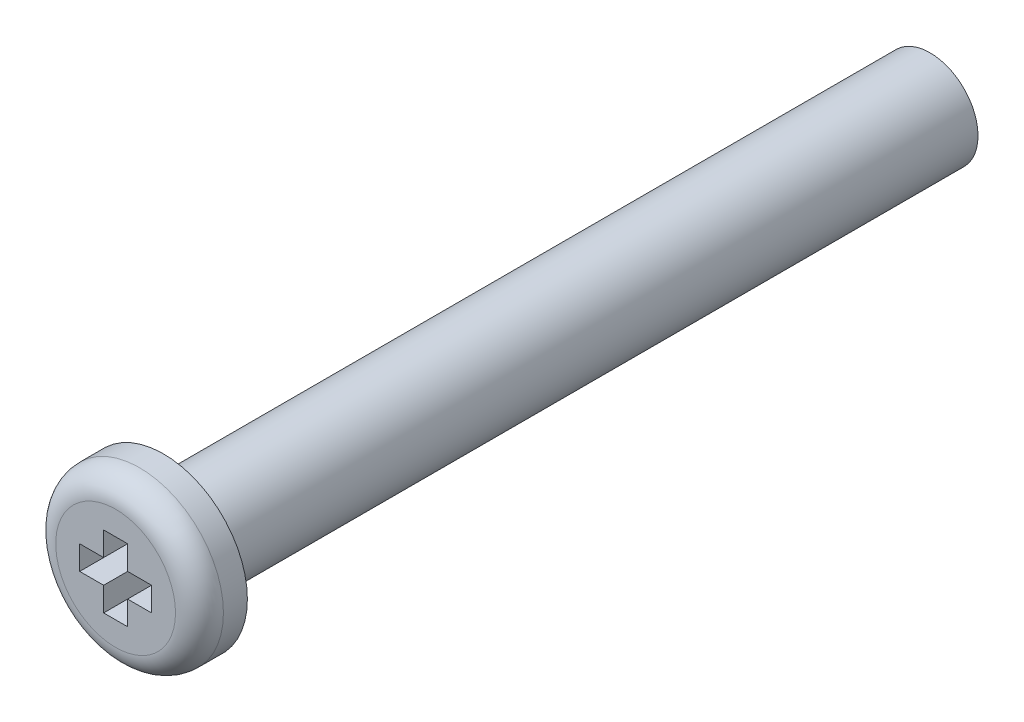
ISO-10303-21;
HEADER;
FILE_DESCRIPTION(('STEP AP214'),'2;1');
FILE_NAME('part.step','',(''),(''),'','','');
FILE_SCHEMA(('AUTOMOTIVE_DESIGN { 1 0 10303 214 1 1 1 1 }'));
ENDSEC;
DATA;
#1=APPLICATION_CONTEXT('core data for automotive mechanical design processes');
#2=APPLICATION_PROTOCOL_DEFINITION('international standard','automotive_design',2000,#1);
#3=PRODUCT_CONTEXT('',#1,'mechanical');
#4=PRODUCT('Part','Part','',(#3));
#5=PRODUCT_RELATED_PRODUCT_CATEGORY('part','',(#4));
#6=PRODUCT_DEFINITION_FORMATION('','',#4);
#7=PRODUCT_DEFINITION_CONTEXT('part definition',#1,'design');
#8=PRODUCT_DEFINITION('design','',#6,#7);
#9=PRODUCT_DEFINITION_SHAPE('','',#8);
#10=(LENGTH_UNIT() NAMED_UNIT(*) SI_UNIT(.MILLI.,.METRE.));
#11=(NAMED_UNIT(*) PLANE_ANGLE_UNIT() SI_UNIT($,.RADIAN.));
#12=(NAMED_UNIT(*) SI_UNIT($,.STERADIAN.) SOLID_ANGLE_UNIT());
#13=UNCERTAINTY_MEASURE_WITH_UNIT(LENGTH_MEASURE(1.E-05),#10,'distance_accuracy_value','');
#14=(GEOMETRIC_REPRESENTATION_CONTEXT(3) GLOBAL_UNCERTAINTY_ASSIGNED_CONTEXT((#13)) GLOBAL_UNIT_ASSIGNED_CONTEXT((#10,
#11,#12)) REPRESENTATION_CONTEXT('',''));
#15=CARTESIAN_POINT('',(0.,0.,0.));
#16=DIRECTION('',(0.,0.,1.));
#17=DIRECTION('',(1.,0.,0.));
#18=AXIS2_PLACEMENT_3D('',#15,#16,#17);
#19=CARTESIAN_POINT('',(0.,0.,32.));
#20=DIRECTION('',(0.,0.,-1.));
#21=DIRECTION('',(-1.,0.,0.));
#22=AXIS2_PLACEMENT_3D('',#19,#20,#21);
#23=CYLINDRICAL_SURFACE('',#22,2.);
#24=CARTESIAN_POINT('',(0.,0.,32.));
#25=DIRECTION('',(0.,0.,1.));
#26=DIRECTION('',(1.,0.,0.));
#27=AXIS2_PLACEMENT_3D('',#24,#25,#26);
#28=CIRCLE('',#27,2.);
#29=CARTESIAN_POINT('',(2.,0.,32.));
#30=VERTEX_POINT('',#29);
#31=EDGE_CURVE('E210',#30,#30,#28,.T.);
#32=ORIENTED_EDGE('',*,*,#31,.F.);
#33=EDGE_LOOP('',(#32));
#34=FACE_BOUND('',#33,.T.);
#35=CARTESIAN_POINT('',(0.,0.,0.));
#36=DIRECTION('',(0.,0.,1.));
#37=DIRECTION('',(1.,0.,0.));
#38=AXIS2_PLACEMENT_3D('',#35,#36,#37);
#39=CIRCLE('',#38,2.);
#40=CARTESIAN_POINT('',(2.,0.,0.));
#41=VERTEX_POINT('',#40);
#42=EDGE_CURVE('E209',#41,#41,#39,.T.);
#43=ORIENTED_EDGE('',*,*,#42,.T.);
#44=EDGE_LOOP('',(#43));
#45=FACE_BOUND('',#44,.T.);
#46=ADVANCED_FACE('F34',(#34,#45),#23,.T.);
#47=CARTESIAN_POINT('',(0.,0.,0.));
#48=DIRECTION('',(0.,0.,1.));
#49=DIRECTION('',(1.,0.,0.));
#50=AXIS2_PLACEMENT_3D('',#47,#48,#49);
#51=PLANE('',#50);
#52=ORIENTED_EDGE('',*,*,#42,.F.);
#53=EDGE_LOOP('',(#52));
#54=FACE_BOUND('',#53,.T.);
#55=ADVANCED_FACE('F233',(#54),#51,.F.);
#56=CARTESIAN_POINT('',(0.,0.,34.));
#57=DIRECTION('',(0.,0.,-1.));
#58=DIRECTION('',(-1.,0.,0.));
#59=AXIS2_PLACEMENT_3D('',#56,#57,#58);
#60=CYLINDRICAL_SURFACE('',#59,3.5);
#61=CARTESIAN_POINT('',(0.,0.,33.));
#62=DIRECTION('',(0.,0.,1.));
#63=DIRECTION('',(1.,0.,0.));
#64=AXIS2_PLACEMENT_3D('',#61,#62,#63);
#65=CIRCLE('',#64,3.5);
#66=CARTESIAN_POINT('',(3.5,0.,33.));
#67=VERTEX_POINT('',#66);
#68=EDGE_CURVE('E11',#67,#67,#65,.F.);
#69=ORIENTED_EDGE('',*,*,#68,.T.);
#70=EDGE_LOOP('',(#69));
#71=FACE_BOUND('',#70,.T.);
#72=CARTESIAN_POINT('',(0.,0.,32.));
#73=DIRECTION('',(0.,0.,1.));
#74=DIRECTION('',(1.,0.,0.));
#75=AXIS2_PLACEMENT_3D('',#72,#73,#74);
#76=CIRCLE('',#75,3.5);
#77=CARTESIAN_POINT('',(3.5,0.,32.));
#78=VERTEX_POINT('',#77);
#79=EDGE_CURVE('E189',#78,#78,#76,.T.);
#80=ORIENTED_EDGE('',*,*,#79,.T.);
#81=EDGE_LOOP('',(#80));
#82=FACE_BOUND('',#81,.T.);
#83=ADVANCED_FACE('F238',(#71,#82),#60,.T.);
#84=CARTESIAN_POINT('',(0.,0.,34.));
#85=DIRECTION('',(0.,0.,1.));
#86=DIRECTION('',(1.,0.,0.));
#87=AXIS2_PLACEMENT_3D('',#84,#85,#86);
#88=PLANE('',#87);
#89=DIRECTION('',(-1.,0.,0.));
#90=VECTOR('',#89,1.);
#91=CARTESIAN_POINT('',(0.,1.5,34.));
#92=LINE('',#91,#90);
#93=CARTESIAN_POINT('',(0.5,1.5,34.));
#94=VERTEX_POINT('',#93);
#95=CARTESIAN_POINT('',(-0.5,1.5,34.));
#96=VERTEX_POINT('',#95);
#97=EDGE_CURVE('E186',#94,#96,#92,.T.);
#98=ORIENTED_EDGE('',*,*,#97,.F.);
#99=DIRECTION('',(0.,1.,0.));
#100=VECTOR('',#99,1.);
#101=CARTESIAN_POINT('',(0.5,1.5,34.));
#102=LINE('',#101,#100);
#103=CARTESIAN_POINT('',(0.5,0.5,34.));
#104=VERTEX_POINT('',#103);
#105=EDGE_CURVE('E184',#104,#94,#102,.T.);
#106=ORIENTED_EDGE('',*,*,#105,.F.);
#107=DIRECTION('',(-1.,0.,0.));
#108=VECTOR('',#107,1.);
#109=CARTESIAN_POINT('',(0.5,0.5,34.));
#110=LINE('',#109,#108);
#111=CARTESIAN_POINT('',(1.5,0.5,34.));
#112=VERTEX_POINT('',#111);
#113=EDGE_CURVE('E182',#112,#104,#110,.T.);
#114=ORIENTED_EDGE('',*,*,#113,.F.);
#115=DIRECTION('',(0.,1.,0.));
#116=VECTOR('',#115,1.);
#117=CARTESIAN_POINT('',(1.5,0.5,34.));
#118=LINE('',#117,#116);
#119=CARTESIAN_POINT('',(1.5,-0.5,34.));
#120=VERTEX_POINT('',#119);
#121=EDGE_CURVE('E133',#120,#112,#118,.T.);
#122=ORIENTED_EDGE('',*,*,#121,.F.);
#123=DIRECTION('',(1.,0.,0.));
#124=VECTOR('',#123,1.);
#125=CARTESIAN_POINT('',(1.5,-0.5,34.));
#126=LINE('',#125,#124);
#127=CARTESIAN_POINT('',(0.5,-0.5,34.));
#128=VERTEX_POINT('',#127);
#129=EDGE_CURVE('E178',#128,#120,#126,.T.);
#130=ORIENTED_EDGE('',*,*,#129,.F.);
#131=DIRECTION('',(0.,1.,0.));
#132=VECTOR('',#131,1.);
#133=CARTESIAN_POINT('',(0.5,-0.5,34.));
#134=LINE('',#133,#132);
#135=CARTESIAN_POINT('',(0.5,-1.5,34.));
#136=VERTEX_POINT('',#135);
#137=EDGE_CURVE('E175',#136,#128,#134,.T.);
#138=ORIENTED_EDGE('',*,*,#137,.F.);
#139=DIRECTION('',(1.,0.,0.));
#140=VECTOR('',#139,1.);
#141=CARTESIAN_POINT('',(0.5,-1.5,34.));
#142=LINE('',#141,#140);
#143=CARTESIAN_POINT('',(-0.5,-1.5,34.));
#144=VERTEX_POINT('',#143);
#145=EDGE_CURVE('E172',#144,#136,#142,.T.);
#146=ORIENTED_EDGE('',*,*,#145,.F.);
#147=DIRECTION('',(0.,-1.,0.));
#148=VECTOR('',#147,1.);
#149=CARTESIAN_POINT('',(-0.5,-1.5,34.));
#150=LINE('',#149,#148);
#151=CARTESIAN_POINT('',(-0.5,-0.5,34.));
#152=VERTEX_POINT('',#151);
#153=EDGE_CURVE('E169',#152,#144,#150,.T.);
#154=ORIENTED_EDGE('',*,*,#153,.F.);
#155=DIRECTION('',(1.,0.,0.));
#156=VECTOR('',#155,1.);
#157=CARTESIAN_POINT('',(-0.5,-0.5,34.));
#158=LINE('',#157,#156);
#159=CARTESIAN_POINT('',(-1.5,-0.5,34.));
#160=VERTEX_POINT('',#159);
#161=EDGE_CURVE('E166',#160,#152,#158,.T.);
#162=ORIENTED_EDGE('',*,*,#161,.F.);
#163=DIRECTION('',(0.,-1.,0.));
#164=VECTOR('',#163,1.);
#165=CARTESIAN_POINT('',(-1.5,-0.5,34.));
#166=LINE('',#165,#164);
#167=CARTESIAN_POINT('',(-1.5,0.5,34.));
#168=VERTEX_POINT('',#167);
#169=EDGE_CURVE('E163',#168,#160,#166,.T.);
#170=ORIENTED_EDGE('',*,*,#169,.F.);
#171=DIRECTION('',(-1.,0.,0.));
#172=VECTOR('',#171,1.);
#173=CARTESIAN_POINT('',(-1.5,0.5,34.));
#174=LINE('',#173,#172);
#175=CARTESIAN_POINT('',(-0.5,0.5,34.));
#176=VERTEX_POINT('',#175);
#177=EDGE_CURVE('E160',#176,#168,#174,.T.);
#178=ORIENTED_EDGE('',*,*,#177,.F.);
#179=DIRECTION('',(0.,-1.,0.));
#180=VECTOR('',#179,1.);
#181=CARTESIAN_POINT('',(-0.5,0.5,34.));
#182=LINE('',#181,#180);
#183=EDGE_CURVE('E158',#96,#176,#182,.T.);
#184=ORIENTED_EDGE('',*,*,#183,.F.);
#185=EDGE_LOOP('',(#98,#106,#114,#122,#130,#138,#146,#154,#162,#170,#178,#184));
#186=FACE_BOUND('',#185,.T.);
#187=CARTESIAN_POINT('',(0.,0.,34.));
#188=DIRECTION('',(0.,0.,1.));
#189=DIRECTION('',(1.,0.,0.));
#190=AXIS2_PLACEMENT_3D('',#187,#188,#189);
#191=CIRCLE('',#190,2.5);
#192=CARTESIAN_POINT('',(2.5,0.,34.));
#193=VERTEX_POINT('',#192);
#194=EDGE_CURVE('E42',#193,#193,#191,.T.);
#195=ORIENTED_EDGE('',*,*,#194,.T.);
#196=EDGE_LOOP('',(#195));
#197=FACE_BOUND('',#196,.T.);
#198=ADVANCED_FACE('F217',(#186,#197),#88,.T.);
#199=CARTESIAN_POINT('',(0.,0.,32.));
#200=DIRECTION('',(0.,0.,1.));
#201=DIRECTION('',(1.,0.,0.));
#202=AXIS2_PLACEMENT_3D('',#199,#200,#201);
#203=PLANE('',#202);
#204=ORIENTED_EDGE('',*,*,#31,.T.);
#205=EDGE_LOOP('',(#204));
#206=FACE_BOUND('',#205,.T.);
#207=ORIENTED_EDGE('',*,*,#79,.F.);
#208=EDGE_LOOP('',(#207));
#209=FACE_BOUND('',#208,.T.);
#210=ADVANCED_FACE('F221',(#206,#209),#203,.F.);
#211=CARTESIAN_POINT('',(0.,0.,33.));
#212=DIRECTION('',(0.,0.,1.));
#213=DIRECTION('',(1.,0.,0.));
#214=AXIS2_PLACEMENT_3D('',#211,#212,#213);
#215=TOROIDAL_SURFACE('',#214,2.5,1.);
#216=ORIENTED_EDGE('',*,*,#68,.F.);
#217=EDGE_LOOP('',(#216));
#218=FACE_BOUND('',#217,.T.);
#219=ORIENTED_EDGE('',*,*,#194,.F.);
#220=EDGE_LOOP('',(#219));
#221=FACE_BOUND('',#220,.T.);
#222=ADVANCED_FACE('F36',(#218,#221),#215,.T.);
#223=CARTESIAN_POINT('',(0.,1.5,32.));
#224=DIRECTION('',(0.,1.,0.));
#225=DIRECTION('',(0.,0.,1.));
#226=AXIS2_PLACEMENT_3D('',#223,#224,#225);
#227=PLANE('',#226);
#228=ORIENTED_EDGE('',*,*,#97,.T.);
#229=DIRECTION('',(0.,0.,1.));
#230=VECTOR('',#229,1.);
#231=CARTESIAN_POINT('',(-0.5,1.5,32.));
#232=LINE('',#231,#230);
#233=CARTESIAN_POINT('',(-0.5,1.5,32.));
#234=VERTEX_POINT('',#233);
#235=EDGE_CURVE('E49',#234,#96,#232,.T.);
#236=ORIENTED_EDGE('',*,*,#235,.F.);
#237=DIRECTION('',(-1.,0.,0.));
#238=VECTOR('',#237,1.);
#239=CARTESIAN_POINT('',(0.,1.5,32.));
#240=LINE('',#239,#238);
#241=CARTESIAN_POINT('',(0.5,1.5,32.));
#242=VERTEX_POINT('',#241);
#243=EDGE_CURVE('E57',#242,#234,#240,.T.);
#244=ORIENTED_EDGE('',*,*,#243,.F.);
#245=DIRECTION('',(0.,0.,1.));
#246=VECTOR('',#245,1.);
#247=CARTESIAN_POINT('',(0.5,1.5,32.));
#248=LINE('',#247,#246);
#249=EDGE_CURVE('E95',#242,#94,#248,.T.);
#250=ORIENTED_EDGE('',*,*,#249,.T.);
#251=EDGE_LOOP('',(#228,#236,#244,#250));
#252=FACE_BOUND('',#251,.T.);
#253=ADVANCED_FACE('F220',(#252),#227,.F.);
#254=CARTESIAN_POINT('',(0.5,1.5,32.));
#255=DIRECTION('',(1.,0.,0.));
#256=DIRECTION('',(0.,1.,0.));
#257=AXIS2_PLACEMENT_3D('',#254,#255,#256);
#258=PLANE('',#257);
#259=ORIENTED_EDGE('',*,*,#105,.T.);
#260=ORIENTED_EDGE('',*,*,#249,.F.);
#261=DIRECTION('',(0.,1.,0.));
#262=VECTOR('',#261,1.);
#263=CARTESIAN_POINT('',(0.5,1.5,32.));
#264=LINE('',#263,#262);
#265=CARTESIAN_POINT('',(0.5,0.5,32.));
#266=VERTEX_POINT('',#265);
#267=EDGE_CURVE('E146',#266,#242,#264,.T.);
#268=ORIENTED_EDGE('',*,*,#267,.F.);
#269=DIRECTION('',(0.,0.,1.));
#270=VECTOR('',#269,1.);
#271=CARTESIAN_POINT('',(0.5,0.5,32.));
#272=LINE('',#271,#270);
#273=EDGE_CURVE('E137',#266,#104,#272,.T.);
#274=ORIENTED_EDGE('',*,*,#273,.T.);
#275=EDGE_LOOP('',(#259,#260,#268,#274));
#276=FACE_BOUND('',#275,.T.);
#277=ADVANCED_FACE('F227',(#276),#258,.F.);
#278=CARTESIAN_POINT('',(0.5,0.5,32.));
#279=DIRECTION('',(0.,1.,0.));
#280=DIRECTION('',(0.,0.,1.));
#281=AXIS2_PLACEMENT_3D('',#278,#279,#280);
#282=PLANE('',#281);
#283=ORIENTED_EDGE('',*,*,#113,.T.);
#284=ORIENTED_EDGE('',*,*,#273,.F.);
#285=DIRECTION('',(-1.,0.,0.));
#286=VECTOR('',#285,1.);
#287=CARTESIAN_POINT('',(0.5,0.5,32.));
#288=LINE('',#287,#286);
#289=CARTESIAN_POINT('',(1.5,0.5,32.));
#290=VERTEX_POINT('',#289);
#291=EDGE_CURVE('E141',#290,#266,#288,.T.);
#292=ORIENTED_EDGE('',*,*,#291,.F.);
#293=DIRECTION('',(0.,0.,1.));
#294=VECTOR('',#293,1.);
#295=CARTESIAN_POINT('',(1.5,0.5,32.));
#296=LINE('',#295,#294);
#297=EDGE_CURVE('E126',#290,#112,#296,.T.);
#298=ORIENTED_EDGE('',*,*,#297,.T.);
#299=EDGE_LOOP('',(#283,#284,#292,#298));
#300=FACE_BOUND('',#299,.T.);
#301=ADVANCED_FACE('F142',(#300),#282,.F.);
#302=CARTESIAN_POINT('',(1.5,0.5,32.));
#303=DIRECTION('',(1.,0.,0.));
#304=DIRECTION('',(0.,1.,0.));
#305=AXIS2_PLACEMENT_3D('',#302,#303,#304);
#306=PLANE('',#305);
#307=ORIENTED_EDGE('',*,*,#121,.T.);
#308=ORIENTED_EDGE('',*,*,#297,.F.);
#309=DIRECTION('',(0.,1.,0.));
#310=VECTOR('',#309,1.);
#311=CARTESIAN_POINT('',(1.5,0.5,32.));
#312=LINE('',#311,#310);
#313=CARTESIAN_POINT('',(1.5,-0.5,32.));
#314=VERTEX_POINT('',#313);
#315=EDGE_CURVE('E130',#314,#290,#312,.T.);
#316=ORIENTED_EDGE('',*,*,#315,.F.);
#317=DIRECTION('',(0.,0.,1.));
#318=VECTOR('',#317,1.);
#319=CARTESIAN_POINT('',(1.5,-0.5,32.));
#320=LINE('',#319,#318);
#321=EDGE_CURVE('E138',#314,#120,#320,.T.);
#322=ORIENTED_EDGE('',*,*,#321,.T.);
#323=EDGE_LOOP('',(#307,#308,#316,#322));
#324=FACE_BOUND('',#323,.T.);
#325=ADVANCED_FACE('F128',(#324),#306,.F.);
#326=CARTESIAN_POINT('',(1.5,-0.5,32.));
#327=DIRECTION('',(0.,-1.,0.));
#328=DIRECTION('',(0.,0.,-1.));
#329=AXIS2_PLACEMENT_3D('',#326,#327,#328);
#330=PLANE('',#329);
#331=ORIENTED_EDGE('',*,*,#129,.T.);
#332=ORIENTED_EDGE('',*,*,#321,.F.);
#333=DIRECTION('',(1.,0.,0.));
#334=VECTOR('',#333,1.);
#335=CARTESIAN_POINT('',(1.5,-0.5,32.));
#336=LINE('',#335,#334);
#337=CARTESIAN_POINT('',(0.5,-0.5,32.));
#338=VERTEX_POINT('',#337);
#339=EDGE_CURVE('E151',#338,#314,#336,.T.);
#340=ORIENTED_EDGE('',*,*,#339,.F.);
#341=DIRECTION('',(0.,0.,1.));
#342=VECTOR('',#341,1.);
#343=CARTESIAN_POINT('',(0.5,-0.5,32.));
#344=LINE('',#343,#342);
#345=EDGE_CURVE('E192',#338,#128,#344,.T.);
#346=ORIENTED_EDGE('',*,*,#345,.T.);
#347=EDGE_LOOP('',(#331,#332,#340,#346));
#348=FACE_BOUND('',#347,.T.);
#349=ADVANCED_FACE('F276',(#348),#330,.F.);
#350=CARTESIAN_POINT('',(0.5,-0.5,32.));
#351=DIRECTION('',(1.,0.,0.));
#352=DIRECTION('',(0.,1.,0.));
#353=AXIS2_PLACEMENT_3D('',#350,#351,#352);
#354=PLANE('',#353);
#355=ORIENTED_EDGE('',*,*,#137,.T.);
#356=ORIENTED_EDGE('',*,*,#345,.F.);
#357=DIRECTION('',(0.,1.,0.));
#358=VECTOR('',#357,1.);
#359=CARTESIAN_POINT('',(0.5,-0.5,32.));
#360=LINE('',#359,#358);
#361=CARTESIAN_POINT('',(0.5,-1.5,32.));
#362=VERTEX_POINT('',#361);
#363=EDGE_CURVE('E153',#362,#338,#360,.T.);
#364=ORIENTED_EDGE('',*,*,#363,.F.);
#365=DIRECTION('',(0.,0.,1.));
#366=VECTOR('',#365,1.);
#367=CARTESIAN_POINT('',(0.5,-1.5,32.));
#368=LINE('',#367,#366);
#369=EDGE_CURVE('E194',#362,#136,#368,.T.);
#370=ORIENTED_EDGE('',*,*,#369,.T.);
#371=EDGE_LOOP('',(#355,#356,#364,#370));
#372=FACE_BOUND('',#371,.T.);
#373=ADVANCED_FACE('F272',(#372),#354,.F.);
#374=CARTESIAN_POINT('',(0.5,-1.5,32.));
#375=DIRECTION('',(0.,-1.,0.));
#376=DIRECTION('',(0.,0.,-1.));
#377=AXIS2_PLACEMENT_3D('',#374,#375,#376);
#378=PLANE('',#377);
#379=ORIENTED_EDGE('',*,*,#145,.T.);
#380=ORIENTED_EDGE('',*,*,#369,.F.);
#381=DIRECTION('',(1.,0.,0.));
#382=VECTOR('',#381,1.);
#383=CARTESIAN_POINT('',(0.5,-1.5,32.));
#384=LINE('',#383,#382);
#385=CARTESIAN_POINT('',(-0.5,-1.5,32.));
#386=VERTEX_POINT('',#385);
#387=EDGE_CURVE('E426',#386,#362,#384,.T.);
#388=ORIENTED_EDGE('',*,*,#387,.F.);
#389=DIRECTION('',(0.,0.,1.));
#390=VECTOR('',#389,1.);
#391=CARTESIAN_POINT('',(-0.5,-1.5,32.));
#392=LINE('',#391,#390);
#393=EDGE_CURVE('E196',#386,#144,#392,.T.);
#394=ORIENTED_EDGE('',*,*,#393,.T.);
#395=EDGE_LOOP('',(#379,#380,#388,#394));
#396=FACE_BOUND('',#395,.T.);
#397=ADVANCED_FACE('F268',(#396),#378,.F.);
#398=CARTESIAN_POINT('',(-0.5,-1.5,32.));
#399=DIRECTION('',(-1.,0.,0.));
#400=DIRECTION('',(0.,0.,1.));
#401=AXIS2_PLACEMENT_3D('',#398,#399,#400);
#402=PLANE('',#401);
#403=ORIENTED_EDGE('',*,*,#153,.T.);
#404=ORIENTED_EDGE('',*,*,#393,.F.);
#405=DIRECTION('',(0.,-1.,0.));
#406=VECTOR('',#405,1.);
#407=CARTESIAN_POINT('',(-0.5,-1.5,32.));
#408=LINE('',#407,#406);
#409=CARTESIAN_POINT('',(-0.5,-0.5,32.));
#410=VERTEX_POINT('',#409);
#411=EDGE_CURVE('E423',#410,#386,#408,.T.);
#412=ORIENTED_EDGE('',*,*,#411,.F.);
#413=DIRECTION('',(0.,0.,1.));
#414=VECTOR('',#413,1.);
#415=CARTESIAN_POINT('',(-0.5,-0.5,32.));
#416=LINE('',#415,#414);
#417=EDGE_CURVE('E198',#410,#152,#416,.T.);
#418=ORIENTED_EDGE('',*,*,#417,.T.);
#419=EDGE_LOOP('',(#403,#404,#412,#418));
#420=FACE_BOUND('',#419,.T.);
#421=ADVANCED_FACE('F264',(#420),#402,.F.);
#422=CARTESIAN_POINT('',(-0.5,-0.5,32.));
#423=DIRECTION('',(0.,-1.,0.));
#424=DIRECTION('',(1.,0.,0.));
#425=AXIS2_PLACEMENT_3D('',#422,#423,#424);
#426=PLANE('',#425);
#427=ORIENTED_EDGE('',*,*,#161,.T.);
#428=ORIENTED_EDGE('',*,*,#417,.F.);
#429=DIRECTION('',(1.,0.,0.));
#430=VECTOR('',#429,1.);
#431=CARTESIAN_POINT('',(-0.5,-0.5,32.));
#432=LINE('',#431,#430);
#433=CARTESIAN_POINT('',(-1.5,-0.5,32.));
#434=VERTEX_POINT('',#433);
#435=EDGE_CURVE('E420',#434,#410,#432,.T.);
#436=ORIENTED_EDGE('',*,*,#435,.F.);
#437=DIRECTION('',(0.,0.,1.));
#438=VECTOR('',#437,1.);
#439=CARTESIAN_POINT('',(-1.5,-0.5,32.));
#440=LINE('',#439,#438);
#441=EDGE_CURVE('E200',#434,#160,#440,.T.);
#442=ORIENTED_EDGE('',*,*,#441,.T.);
#443=EDGE_LOOP('',(#427,#428,#436,#442));
#444=FACE_BOUND('',#443,.T.);
#445=ADVANCED_FACE('F260',(#444),#426,.F.);
#446=CARTESIAN_POINT('',(-1.5,-0.5,32.));
#447=DIRECTION('',(-1.,0.,0.));
#448=DIRECTION('',(0.,0.,1.));
#449=AXIS2_PLACEMENT_3D('',#446,#447,#448);
#450=PLANE('',#449);
#451=ORIENTED_EDGE('',*,*,#169,.T.);
#452=ORIENTED_EDGE('',*,*,#441,.F.);
#453=DIRECTION('',(0.,-1.,0.));
#454=VECTOR('',#453,1.);
#455=CARTESIAN_POINT('',(-1.5,-0.5,32.));
#456=LINE('',#455,#454);
#457=CARTESIAN_POINT('',(-1.5,0.5,32.));
#458=VERTEX_POINT('',#457);
#459=EDGE_CURVE('E414',#458,#434,#456,.T.);
#460=ORIENTED_EDGE('',*,*,#459,.F.);
#461=DIRECTION('',(0.,0.,1.));
#462=VECTOR('',#461,1.);
#463=CARTESIAN_POINT('',(-1.5,0.5,32.));
#464=LINE('',#463,#462);
#465=EDGE_CURVE('E202',#458,#168,#464,.T.);
#466=ORIENTED_EDGE('',*,*,#465,.T.);
#467=EDGE_LOOP('',(#451,#452,#460,#466));
#468=FACE_BOUND('',#467,.T.);
#469=ADVANCED_FACE('F256',(#468),#450,.F.);
#470=CARTESIAN_POINT('',(-1.5,0.5,32.));
#471=DIRECTION('',(0.,1.,0.));
#472=DIRECTION('',(0.,0.,1.));
#473=AXIS2_PLACEMENT_3D('',#470,#471,#472);
#474=PLANE('',#473);
#475=ORIENTED_EDGE('',*,*,#177,.T.);
#476=ORIENTED_EDGE('',*,*,#465,.F.);
#477=DIRECTION('',(-1.,0.,0.));
#478=VECTOR('',#477,1.);
#479=CARTESIAN_POINT('',(-1.5,0.5,32.));
#480=LINE('',#479,#478);
#481=CARTESIAN_POINT('',(-0.5,0.5,32.));
#482=VERTEX_POINT('',#481);
#483=EDGE_CURVE('E411',#482,#458,#480,.T.);
#484=ORIENTED_EDGE('',*,*,#483,.F.);
#485=DIRECTION('',(0.,0.,1.));
#486=VECTOR('',#485,1.);
#487=CARTESIAN_POINT('',(-0.5,0.5,32.));
#488=LINE('',#487,#486);
#489=EDGE_CURVE('E204',#482,#176,#488,.T.);
#490=ORIENTED_EDGE('',*,*,#489,.T.);
#491=EDGE_LOOP('',(#475,#476,#484,#490));
#492=FACE_BOUND('',#491,.T.);
#493=ADVANCED_FACE('F253',(#492),#474,.F.);
#494=CARTESIAN_POINT('',(-0.5,0.5,32.));
#495=DIRECTION('',(-1.,0.,0.));
#496=DIRECTION('',(0.,0.,1.));
#497=AXIS2_PLACEMENT_3D('',#494,#495,#496);
#498=PLANE('',#497);
#499=ORIENTED_EDGE('',*,*,#183,.T.);
#500=ORIENTED_EDGE('',*,*,#489,.F.);
#501=DIRECTION('',(0.,-1.,0.));
#502=VECTOR('',#501,1.);
#503=CARTESIAN_POINT('',(-0.5,0.5,32.));
#504=LINE('',#503,#502);
#505=EDGE_CURVE('E409',#234,#482,#504,.T.);
#506=ORIENTED_EDGE('',*,*,#505,.F.);
#507=ORIENTED_EDGE('',*,*,#235,.T.);
#508=EDGE_LOOP('',(#499,#500,#506,#507));
#509=FACE_BOUND('',#508,.T.);
#510=ADVANCED_FACE('F250',(#509),#498,.F.);
#511=CARTESIAN_POINT('',(0.,0.,32.));
#512=DIRECTION('',(0.,0.,-1.));
#513=DIRECTION('',(-1.,0.,0.));
#514=AXIS2_PLACEMENT_3D('',#511,#512,#513);
#515=PLANE('',#514);
#516=ORIENTED_EDGE('',*,*,#243,.T.);
#517=ORIENTED_EDGE('',*,*,#505,.T.);
#518=ORIENTED_EDGE('',*,*,#483,.T.);
#519=ORIENTED_EDGE('',*,*,#459,.T.);
#520=ORIENTED_EDGE('',*,*,#435,.T.);
#521=ORIENTED_EDGE('',*,*,#411,.T.);
#522=ORIENTED_EDGE('',*,*,#387,.T.);
#523=ORIENTED_EDGE('',*,*,#363,.T.);
#524=ORIENTED_EDGE('',*,*,#339,.T.);
#525=ORIENTED_EDGE('',*,*,#315,.T.);
#526=ORIENTED_EDGE('',*,*,#291,.T.);
#527=ORIENTED_EDGE('',*,*,#267,.T.);
#528=EDGE_LOOP('',(#516,#517,#518,#519,#520,#521,#522,#523,#524,#525,#526,#527));
#529=FACE_BOUND('',#528,.T.);
#530=ADVANCED_FACE('F148',(#529),#515,.F.);
#531=CLOSED_SHELL('',(#46,#55,#83,#198,#210,#222,#253,#277,#301,#325,#349,#373,#397,#421,#445,
#469,#493,#510,#530));
#532=MANIFOLD_SOLID_BREP('B2',#531);
#533=ADVANCED_BREP_SHAPE_REPRESENTATION('',(#18,#532),#14);
#534=SHAPE_DEFINITION_REPRESENTATION(#9,#533);
ENDSEC;
END-ISO-10303-21;
